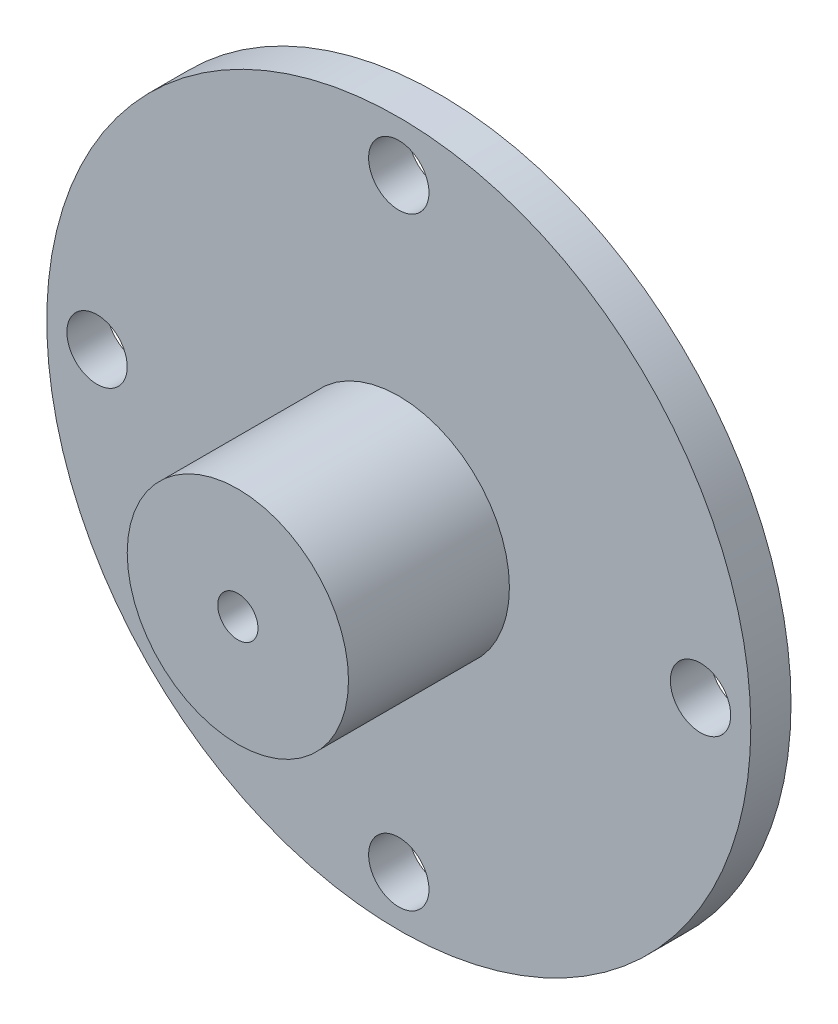
ISO-10303-21;
HEADER;
FILE_DESCRIPTION(('STEP AP214'),'2;1');
FILE_NAME('part.step','',(''),(''),'','','');
FILE_SCHEMA(('AUTOMOTIVE_DESIGN { 1 0 10303 214 1 1 1 1 }'));
ENDSEC;
DATA;
#1=APPLICATION_CONTEXT('core data for automotive mechanical design processes');
#2=APPLICATION_PROTOCOL_DEFINITION('international standard','automotive_design',2000,#1);
#3=PRODUCT_CONTEXT('',#1,'mechanical');
#4=PRODUCT('Part','Part','',(#3));
#5=PRODUCT_RELATED_PRODUCT_CATEGORY('part','',(#4));
#6=PRODUCT_DEFINITION_FORMATION('','',#4);
#7=PRODUCT_DEFINITION_CONTEXT('part definition',#1,'design');
#8=PRODUCT_DEFINITION('design','',#6,#7);
#9=PRODUCT_DEFINITION_SHAPE('','',#8);
#10=(LENGTH_UNIT() NAMED_UNIT(*) SI_UNIT(.MILLI.,.METRE.));
#11=(NAMED_UNIT(*) PLANE_ANGLE_UNIT() SI_UNIT($,.RADIAN.));
#12=(NAMED_UNIT(*) SI_UNIT($,.STERADIAN.) SOLID_ANGLE_UNIT());
#13=UNCERTAINTY_MEASURE_WITH_UNIT(LENGTH_MEASURE(1.E-05),#10,'distance_accuracy_value','');
#14=(GEOMETRIC_REPRESENTATION_CONTEXT(3) GLOBAL_UNCERTAINTY_ASSIGNED_CONTEXT((#13)) GLOBAL_UNIT_ASSIGNED_CONTEXT((#10,
#11,#12)) REPRESENTATION_CONTEXT('',''));
#15=CARTESIAN_POINT('',(0.,0.,0.));
#16=DIRECTION('',(0.,0.,1.));
#17=DIRECTION('',(1.,0.,0.));
#18=AXIS2_PLACEMENT_3D('',#15,#16,#17);
#19=CARTESIAN_POINT('',(-15.,0.,2.));
#20=DIRECTION('',(0.,0.,-1.));
#21=DIRECTION('',(-1.,0.,0.));
#22=AXIS2_PLACEMENT_3D('',#19,#20,#21);
#23=CYLINDRICAL_SURFACE('',#22,1.5);
#24=CARTESIAN_POINT('',(-15.,0.,2.));
#25=DIRECTION('',(0.,0.,1.));
#26=DIRECTION('',(1.,0.,0.));
#27=AXIS2_PLACEMENT_3D('',#24,#25,#26);
#28=CIRCLE('',#27,1.5);
#29=CARTESIAN_POINT('',(-13.5,0.,2.));
#30=VERTEX_POINT('',#29);
#31=EDGE_CURVE('E50',#30,#30,#28,.T.);
#32=ORIENTED_EDGE('',*,*,#31,.T.);
#33=EDGE_LOOP('',(#32));
#34=FACE_BOUND('',#33,.T.);
#35=CARTESIAN_POINT('',(-15.,0.,0.));
#36=DIRECTION('',(0.,0.,1.));
#37=DIRECTION('',(1.,0.,0.));
#38=AXIS2_PLACEMENT_3D('',#35,#36,#37);
#39=CIRCLE('',#38,1.5);
#40=CARTESIAN_POINT('',(-13.5,0.,0.));
#41=VERTEX_POINT('',#40);
#42=EDGE_CURVE('E105',#41,#41,#39,.T.);
#43=ORIENTED_EDGE('',*,*,#42,.F.);
#44=EDGE_LOOP('',(#43));
#45=FACE_BOUND('',#44,.T.);
#46=ADVANCED_FACE('F41',(#34,#45),#23,.F.);
#47=CARTESIAN_POINT('',(0.,-15.,2.));
#48=DIRECTION('',(0.,0.,-1.));
#49=DIRECTION('',(-1.,0.,0.));
#50=AXIS2_PLACEMENT_3D('',#47,#48,#49);
#51=CYLINDRICAL_SURFACE('',#50,1.5);
#52=CARTESIAN_POINT('',(0.,-15.,2.));
#53=DIRECTION('',(0.,0.,1.));
#54=DIRECTION('',(1.,0.,0.));
#55=AXIS2_PLACEMENT_3D('',#52,#53,#54);
#56=CIRCLE('',#55,1.5);
#57=CARTESIAN_POINT('',(1.5,-15.,2.));
#58=VERTEX_POINT('',#57);
#59=EDGE_CURVE('E88',#58,#58,#56,.T.);
#60=ORIENTED_EDGE('',*,*,#59,.T.);
#61=EDGE_LOOP('',(#60));
#62=FACE_BOUND('',#61,.T.);
#63=CARTESIAN_POINT('',(0.,-15.,0.));
#64=DIRECTION('',(0.,0.,1.));
#65=DIRECTION('',(1.,0.,0.));
#66=AXIS2_PLACEMENT_3D('',#63,#64,#65);
#67=CIRCLE('',#66,1.5);
#68=CARTESIAN_POINT('',(1.5,-15.,0.));
#69=VERTEX_POINT('',#68);
#70=EDGE_CURVE('E102',#69,#69,#67,.T.);
#71=ORIENTED_EDGE('',*,*,#70,.F.);
#72=EDGE_LOOP('',(#71));
#73=FACE_BOUND('',#72,.T.);
#74=ADVANCED_FACE('F133',(#62,#73),#51,.F.);
#75=CARTESIAN_POINT('',(15.,0.,2.));
#76=DIRECTION('',(0.,0.,-1.));
#77=DIRECTION('',(-1.,0.,0.));
#78=AXIS2_PLACEMENT_3D('',#75,#76,#77);
#79=CYLINDRICAL_SURFACE('',#78,1.5);
#80=CARTESIAN_POINT('',(15.,0.,2.));
#81=DIRECTION('',(0.,0.,1.));
#82=DIRECTION('',(1.,0.,0.));
#83=AXIS2_PLACEMENT_3D('',#80,#81,#82);
#84=CIRCLE('',#83,1.5);
#85=CARTESIAN_POINT('',(16.5,0.,2.));
#86=VERTEX_POINT('',#85);
#87=EDGE_CURVE('E84',#86,#86,#84,.T.);
#88=ORIENTED_EDGE('',*,*,#87,.T.);
#89=EDGE_LOOP('',(#88));
#90=FACE_BOUND('',#89,.T.);
#91=CARTESIAN_POINT('',(15.,0.,0.));
#92=DIRECTION('',(0.,0.,1.));
#93=DIRECTION('',(1.,0.,0.));
#94=AXIS2_PLACEMENT_3D('',#91,#92,#93);
#95=CIRCLE('',#94,1.5);
#96=CARTESIAN_POINT('',(16.5,0.,0.));
#97=VERTEX_POINT('',#96);
#98=EDGE_CURVE('E98',#97,#97,#95,.T.);
#99=ORIENTED_EDGE('',*,*,#98,.F.);
#100=EDGE_LOOP('',(#99));
#101=FACE_BOUND('',#100,.T.);
#102=ADVANCED_FACE('F139',(#90,#101),#79,.F.);
#103=CARTESIAN_POINT('',(0.,15.,2.));
#104=DIRECTION('',(0.,0.,-1.));
#105=DIRECTION('',(-1.,0.,0.));
#106=AXIS2_PLACEMENT_3D('',#103,#104,#105);
#107=CYLINDRICAL_SURFACE('',#106,1.5);
#108=CARTESIAN_POINT('',(0.,15.,2.));
#109=DIRECTION('',(0.,0.,1.));
#110=DIRECTION('',(1.,0.,0.));
#111=AXIS2_PLACEMENT_3D('',#108,#109,#110);
#112=CIRCLE('',#111,1.5);
#113=CARTESIAN_POINT('',(1.5,15.,2.));
#114=VERTEX_POINT('',#113);
#115=EDGE_CURVE('E80',#114,#114,#112,.T.);
#116=ORIENTED_EDGE('',*,*,#115,.T.);
#117=EDGE_LOOP('',(#116));
#118=FACE_BOUND('',#117,.T.);
#119=CARTESIAN_POINT('',(0.,15.,0.));
#120=DIRECTION('',(0.,0.,1.));
#121=DIRECTION('',(1.,0.,0.));
#122=AXIS2_PLACEMENT_3D('',#119,#120,#121);
#123=CIRCLE('',#122,1.5);
#124=CARTESIAN_POINT('',(1.5,15.,0.));
#125=VERTEX_POINT('',#124);
#126=EDGE_CURVE('E71',#125,#125,#123,.T.);
#127=ORIENTED_EDGE('',*,*,#126,.F.);
#128=EDGE_LOOP('',(#127));
#129=FACE_BOUND('',#128,.T.);
#130=ADVANCED_FACE('F43',(#118,#129),#107,.F.);
#131=CARTESIAN_POINT('',(0.,0.,2.));
#132=DIRECTION('',(0.,0.,-1.));
#133=DIRECTION('',(-1.,0.,0.));
#134=AXIS2_PLACEMENT_3D('',#131,#132,#133);
#135=CYLINDRICAL_SURFACE('',#134,17.5);
#136=CARTESIAN_POINT('',(0.,0.,2.));
#137=DIRECTION('',(0.,0.,1.));
#138=DIRECTION('',(1.,0.,0.));
#139=AXIS2_PLACEMENT_3D('',#136,#137,#138);
#140=CIRCLE('',#139,17.5);
#141=CARTESIAN_POINT('',(17.5,0.,2.));
#142=VERTEX_POINT('',#141);
#143=EDGE_CURVE('E11',#142,#142,#140,.T.);
#144=ORIENTED_EDGE('',*,*,#143,.F.);
#145=EDGE_LOOP('',(#144));
#146=FACE_BOUND('',#145,.T.);
#147=CARTESIAN_POINT('',(0.,0.,0.));
#148=DIRECTION('',(0.,0.,1.));
#149=DIRECTION('',(1.,0.,0.));
#150=AXIS2_PLACEMENT_3D('',#147,#148,#149);
#151=CIRCLE('',#150,17.5);
#152=CARTESIAN_POINT('',(17.5,0.,0.));
#153=VERTEX_POINT('',#152);
#154=EDGE_CURVE('E45',#153,#153,#151,.T.);
#155=ORIENTED_EDGE('',*,*,#154,.T.);
#156=EDGE_LOOP('',(#155));
#157=FACE_BOUND('',#156,.T.);
#158=ADVANCED_FACE('F114',(#146,#157),#135,.T.);
#159=CARTESIAN_POINT('',(0.,0.,2.));
#160=DIRECTION('',(0.,0.,1.));
#161=DIRECTION('',(1.,0.,0.));
#162=AXIS2_PLACEMENT_3D('',#159,#160,#161);
#163=PLANE('',#162);
#164=CARTESIAN_POINT('',(0.,0.,2.));
#165=DIRECTION('',(0.,0.,1.));
#166=DIRECTION('',(1.,0.,0.));
#167=AXIS2_PLACEMENT_3D('',#164,#165,#166);
#168=CIRCLE('',#167,5.5);
#169=CARTESIAN_POINT('',(5.5,0.,2.));
#170=VERTEX_POINT('',#169);
#171=EDGE_CURVE('E76',#170,#170,#168,.T.);
#172=ORIENTED_EDGE('',*,*,#171,.F.);
#173=EDGE_LOOP('',(#172));
#174=FACE_BOUND('',#173,.T.);
#175=ORIENTED_EDGE('',*,*,#115,.F.);
#176=EDGE_LOOP('',(#175));
#177=FACE_BOUND('',#176,.T.);
#178=ORIENTED_EDGE('',*,*,#87,.F.);
#179=EDGE_LOOP('',(#178));
#180=FACE_BOUND('',#179,.T.);
#181=ORIENTED_EDGE('',*,*,#59,.F.);
#182=EDGE_LOOP('',(#181));
#183=FACE_BOUND('',#182,.T.);
#184=ORIENTED_EDGE('',*,*,#31,.F.);
#185=EDGE_LOOP('',(#184));
#186=FACE_BOUND('',#185,.T.);
#187=ORIENTED_EDGE('',*,*,#143,.T.);
#188=EDGE_LOOP('',(#187));
#189=FACE_BOUND('',#188,.T.);
#190=ADVANCED_FACE('F119',(#174,#177,#180,#183,#186,#189),#163,.T.);
#191=CARTESIAN_POINT('',(0.,0.,0.));
#192=DIRECTION('',(0.,0.,1.));
#193=DIRECTION('',(1.,0.,0.));
#194=AXIS2_PLACEMENT_3D('',#191,#192,#193);
#195=PLANE('',#194);
#196=ORIENTED_EDGE('',*,*,#126,.T.);
#197=EDGE_LOOP('',(#196));
#198=FACE_BOUND('',#197,.T.);
#199=ORIENTED_EDGE('',*,*,#98,.T.);
#200=EDGE_LOOP('',(#199));
#201=FACE_BOUND('',#200,.T.);
#202=ORIENTED_EDGE('',*,*,#70,.T.);
#203=EDGE_LOOP('',(#202));
#204=FACE_BOUND('',#203,.T.);
#205=ORIENTED_EDGE('',*,*,#42,.T.);
#206=EDGE_LOOP('',(#205));
#207=FACE_BOUND('',#206,.T.);
#208=ORIENTED_EDGE('',*,*,#154,.F.);
#209=EDGE_LOOP('',(#208));
#210=FACE_BOUND('',#209,.T.);
#211=ADVANCED_FACE('F116',(#198,#201,#204,#207,#210),#195,.F.);
#212=CARTESIAN_POINT('',(0.,0.,10.));
#213=DIRECTION('',(0.,0.,-1.));
#214=DIRECTION('',(-1.,0.,0.));
#215=AXIS2_PLACEMENT_3D('',#212,#213,#214);
#216=CYLINDRICAL_SURFACE('',#215,5.5);
#217=ORIENTED_EDGE('',*,*,#171,.T.);
#218=EDGE_LOOP('',(#217));
#219=FACE_BOUND('',#218,.T.);
#220=CARTESIAN_POINT('',(0.,0.,10.));
#221=DIRECTION('',(0.,0.,1.));
#222=DIRECTION('',(1.,0.,0.));
#223=AXIS2_PLACEMENT_3D('',#220,#221,#222);
#224=CIRCLE('',#223,5.5);
#225=CARTESIAN_POINT('',(5.5,0.,10.));
#226=VERTEX_POINT('',#225);
#227=EDGE_CURVE('E65',#226,#226,#224,.T.);
#228=ORIENTED_EDGE('',*,*,#227,.F.);
#229=EDGE_LOOP('',(#228));
#230=FACE_BOUND('',#229,.T.);
#231=ADVANCED_FACE('F118',(#219,#230),#216,.T.);
#232=CARTESIAN_POINT('',(0.,0.,10.));
#233=DIRECTION('',(0.,0.,1.));
#234=DIRECTION('',(1.,0.,0.));
#235=AXIS2_PLACEMENT_3D('',#232,#233,#234);
#236=PLANE('',#235);
#237=CARTESIAN_POINT('',(0.,0.,10.));
#238=DIRECTION('',(0.,0.,1.));
#239=DIRECTION('',(1.,0.,0.));
#240=AXIS2_PLACEMENT_3D('',#237,#238,#239);
#241=CIRCLE('',#240,1.);
#242=CARTESIAN_POINT('',(1.,0.,10.));
#243=VERTEX_POINT('',#242);
#244=EDGE_CURVE('E66',#243,#243,#241,.T.);
#245=ORIENTED_EDGE('',*,*,#244,.F.);
#246=EDGE_LOOP('',(#245));
#247=FACE_BOUND('',#246,.T.);
#248=ORIENTED_EDGE('',*,*,#227,.T.);
#249=EDGE_LOOP('',(#248));
#250=FACE_BOUND('',#249,.T.);
#251=ADVANCED_FACE('F58',(#247,#250),#236,.T.);
#252=CARTESIAN_POINT('',(0.,0.,7.));
#253=DIRECTION('',(0.,0.,1.));
#254=DIRECTION('',(1.,0.,0.));
#255=AXIS2_PLACEMENT_3D('',#252,#253,#254);
#256=CONICAL_SURFACE('',#255,0.999999999999999,1.02974425867665);
#257=CARTESIAN_POINT('',(0.,0.,6.39913938097244));
#258=VERTEX_POINT('',#257);
#259=VERTEX_LOOP('',#258);
#260=FACE_BOUND('',#259,.T.);
#261=CARTESIAN_POINT('',(0.,0.,7.));
#262=DIRECTION('',(0.,0.,1.));
#263=DIRECTION('',(1.,0.,0.));
#264=AXIS2_PLACEMENT_3D('',#261,#262,#263);
#265=CIRCLE('',#264,0.999999999999999);
#266=CARTESIAN_POINT('',(0.999999999999999,0.,7.));
#267=VERTEX_POINT('',#266);
#268=EDGE_CURVE('E62',#267,#267,#265,.T.);
#269=ORIENTED_EDGE('',*,*,#268,.T.);
#270=EDGE_LOOP('',(#269));
#271=FACE_BOUND('',#270,.T.);
#272=ADVANCED_FACE('F54',(#260,#271),#256,.F.);
#273=CARTESIAN_POINT('',(0.,0.,10.));
#274=DIRECTION('',(0.,0.,1.));
#275=DIRECTION('',(1.,0.,0.));
#276=AXIS2_PLACEMENT_3D('',#273,#274,#275);
#277=CYLINDRICAL_SURFACE('',#276,1.);
#278=ORIENTED_EDGE('',*,*,#268,.F.);
#279=EDGE_LOOP('',(#278));
#280=FACE_BOUND('',#279,.T.);
#281=ORIENTED_EDGE('',*,*,#244,.T.);
#282=EDGE_LOOP('',(#281));
#283=FACE_BOUND('',#282,.T.);
#284=ADVANCED_FACE('F57',(#280,#283),#277,.F.);
#285=CLOSED_SHELL('',(#46,#74,#102,#130,#158,#190,#211,#231,#251,#272,#284));
#286=MANIFOLD_SOLID_BREP('B2',#285);
#287=ADVANCED_BREP_SHAPE_REPRESENTATION('',(#18,#286),#14);
#288=SHAPE_DEFINITION_REPRESENTATION(#9,#287);
ENDSEC;
END-ISO-10303-21;
